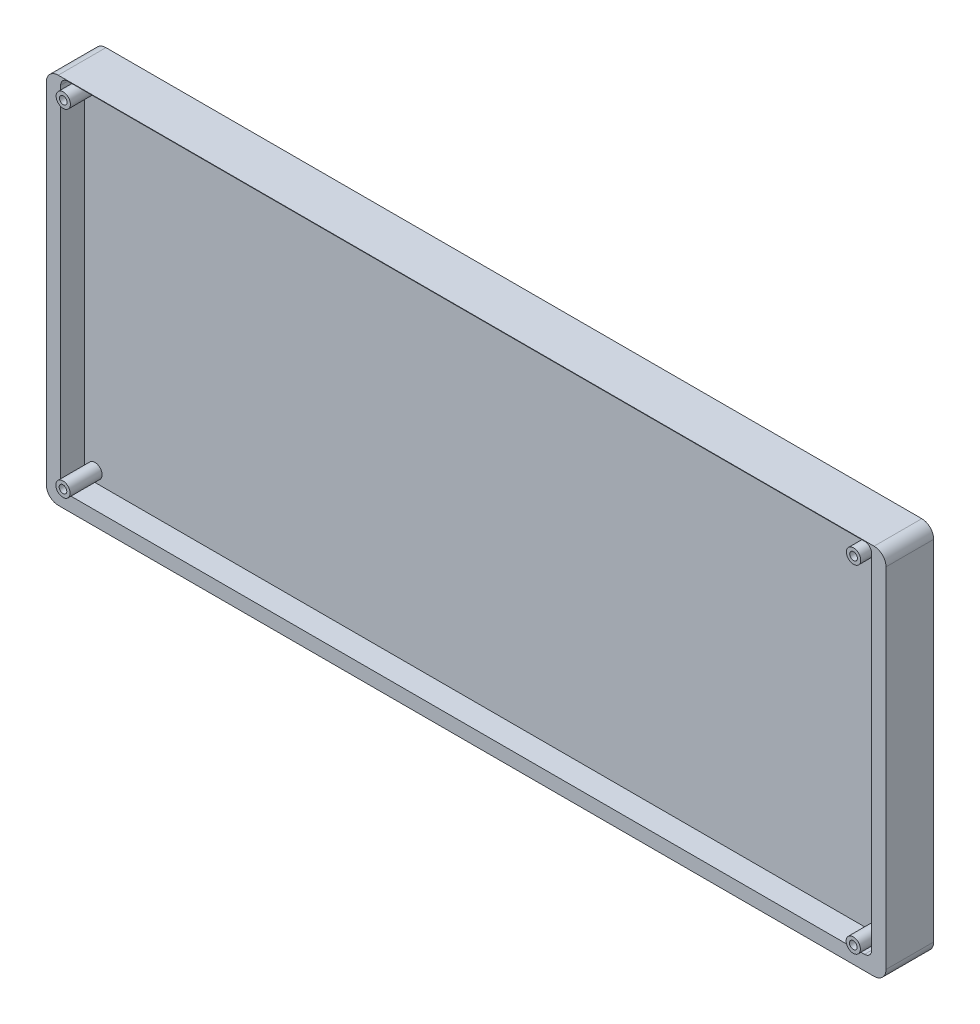
ISO-10303-21;
HEADER;
FILE_DESCRIPTION(('STEP AP214'),'2;1');
FILE_NAME('part.step','',(''),(''),'','','');
FILE_SCHEMA(('AUTOMOTIVE_DESIGN { 1 0 10303 214 1 1 1 1 }'));
ENDSEC;
DATA;
#1=APPLICATION_CONTEXT('core data for automotive mechanical design processes');
#2=APPLICATION_PROTOCOL_DEFINITION('international standard','automotive_design',2000,#1);
#3=PRODUCT_CONTEXT('',#1,'mechanical');
#4=PRODUCT('Part','Part','',(#3));
#5=PRODUCT_RELATED_PRODUCT_CATEGORY('part','',(#4));
#6=PRODUCT_DEFINITION_FORMATION('','',#4);
#7=PRODUCT_DEFINITION_CONTEXT('part definition',#1,'design');
#8=PRODUCT_DEFINITION('design','',#6,#7);
#9=PRODUCT_DEFINITION_SHAPE('','',#8);
#10=(LENGTH_UNIT() NAMED_UNIT(*) SI_UNIT(.MILLI.,.METRE.));
#11=(NAMED_UNIT(*) PLANE_ANGLE_UNIT() SI_UNIT($,.RADIAN.));
#12=(NAMED_UNIT(*) SI_UNIT($,.STERADIAN.) SOLID_ANGLE_UNIT());
#13=UNCERTAINTY_MEASURE_WITH_UNIT(LENGTH_MEASURE(1.E-05),#10,'distance_accuracy_value','');
#14=(GEOMETRIC_REPRESENTATION_CONTEXT(3) GLOBAL_UNCERTAINTY_ASSIGNED_CONTEXT((#13)) GLOBAL_UNIT_ASSIGNED_CONTEXT((#10,
#11,#12)) REPRESENTATION_CONTEXT('',''));
#15=CARTESIAN_POINT('',(0.,0.,0.));
#16=DIRECTION('',(0.,0.,1.));
#17=DIRECTION('',(1.,0.,0.));
#18=AXIS2_PLACEMENT_3D('',#15,#16,#17);
#19=CARTESIAN_POINT('',(374.280338174869,216.552249566486,10.));
#20=DIRECTION('',(0.,0.,-1.));
#21=DIRECTION('',(-1.,0.,0.));
#22=AXIS2_PLACEMENT_3D('',#19,#20,#21);
#23=CYLINDRICAL_SURFACE('',#22,1.60000381001004);
#24=CARTESIAN_POINT('',(374.280338174869,216.552249566486,10.));
#25=DIRECTION('',(0.,0.,1.));
#26=DIRECTION('',(1.,0.,0.));
#27=AXIS2_PLACEMENT_3D('',#24,#25,#26);
#28=CIRCLE('',#27,1.60000381001004);
#29=CARTESIAN_POINT('',(375.880341984879,216.552249566486,10.));
#30=VERTEX_POINT('',#29);
#31=EDGE_CURVE('E332',#30,#30,#28,.T.);
#32=ORIENTED_EDGE('',*,*,#31,.F.);
#33=EDGE_LOOP('',(#32));
#34=FACE_BOUND('',#33,.T.);
#35=CARTESIAN_POINT('',(374.280338174869,216.552249566486,23.4006327065293));
#36=DIRECTION('',(0.,0.,-1.));
#37=DIRECTION('',(-1.,0.,0.));
#38=AXIS2_PLACEMENT_3D('',#35,#36,#37);
#39=CIRCLE('',#38,1.60000381001004);
#40=CARTESIAN_POINT('',(372.680334364859,216.552249566486,23.4006327065293));
#41=VERTEX_POINT('',#40);
#42=EDGE_CURVE('E372',#41,#41,#39,.F.);
#43=ORIENTED_EDGE('',*,*,#42,.T.);
#44=EDGE_LOOP('',(#43));
#45=FACE_BOUND('',#44,.T.);
#46=ADVANCED_FACE('F41',(#34,#45),#23,.F.);
#47=CARTESIAN_POINT('',(43.0180877304192,216.425249312486,10.));
#48=DIRECTION('',(0.,0.,-1.));
#49=DIRECTION('',(-1.,0.,0.));
#50=AXIS2_PLACEMENT_3D('',#47,#48,#49);
#51=CYLINDRICAL_SURFACE('',#50,1.600003810008);
#52=CARTESIAN_POINT('',(43.0180877304192,216.425249312486,10.));
#53=DIRECTION('',(0.,0.,1.));
#54=DIRECTION('',(1.,0.,0.));
#55=AXIS2_PLACEMENT_3D('',#52,#53,#54);
#56=CIRCLE('',#55,1.600003810008);
#57=CARTESIAN_POINT('',(44.6180915404272,216.425249312486,10.));
#58=VERTEX_POINT('',#57);
#59=EDGE_CURVE('E11',#58,#58,#56,.T.);
#60=ORIENTED_EDGE('',*,*,#59,.F.);
#61=EDGE_LOOP('',(#60));
#62=FACE_BOUND('',#61,.T.);
#63=CARTESIAN_POINT('',(43.0180877304186,216.425249312487,23.4006327065293));
#64=DIRECTION('',(0.,0.,-1.));
#65=DIRECTION('',(-1.,0.,0.));
#66=AXIS2_PLACEMENT_3D('',#63,#64,#65);
#67=CIRCLE('',#66,1.600003810008);
#68=CARTESIAN_POINT('',(41.4180839204107,216.425249312487,23.4006327065293));
#69=VERTEX_POINT('',#68);
#70=EDGE_CURVE('E355',#69,#69,#67,.F.);
#71=ORIENTED_EDGE('',*,*,#70,.T.);
#72=EDGE_LOOP('',(#71));
#73=FACE_BOUND('',#72,.T.);
#74=ADVANCED_FACE('F342',(#62,#73),#51,.F.);
#75=CARTESIAN_POINT('',(42.8910874764192,75.1779671179253,10.));
#76=DIRECTION('',(0.,0.,-1.));
#77=DIRECTION('',(-1.,0.,0.));
#78=AXIS2_PLACEMENT_3D('',#75,#76,#77);
#79=CYLINDRICAL_SURFACE('',#78,1.600003810008);
#80=CARTESIAN_POINT('',(42.8910874764192,75.1779671179253,10.));
#81=DIRECTION('',(0.,0.,1.));
#82=DIRECTION('',(1.,0.,0.));
#83=AXIS2_PLACEMENT_3D('',#80,#81,#82);
#84=CIRCLE('',#83,1.600003810008);
#85=CARTESIAN_POINT('',(44.4910912864272,75.1779671179253,10.));
#86=VERTEX_POINT('',#85);
#87=EDGE_CURVE('E50',#86,#86,#84,.T.);
#88=ORIENTED_EDGE('',*,*,#87,.F.);
#89=EDGE_LOOP('',(#88));
#90=FACE_BOUND('',#89,.T.);
#91=CARTESIAN_POINT('',(42.8910874764186,75.1779671179263,23.4006327065293));
#92=DIRECTION('',(0.,0.,-1.));
#93=DIRECTION('',(-1.,0.,0.));
#94=AXIS2_PLACEMENT_3D('',#91,#92,#93);
#95=CIRCLE('',#94,1.600003810008);
#96=CARTESIAN_POINT('',(41.2910836664107,75.1779671179263,23.4006327065293));
#97=VERTEX_POINT('',#96);
#98=EDGE_CURVE('E345',#97,#97,#95,.F.);
#99=ORIENTED_EDGE('',*,*,#98,.T.);
#100=EDGE_LOOP('',(#99));
#101=FACE_BOUND('',#100,.T.);
#102=ADVANCED_FACE('F339',(#90,#101),#79,.F.);
#103=CARTESIAN_POINT('',(374.153337920869,75.3049673719253,10.));
#104=DIRECTION('',(0.,0.,-1.));
#105=DIRECTION('',(-1.,0.,0.));
#106=AXIS2_PLACEMENT_3D('',#103,#104,#105);
#107=CYLINDRICAL_SURFACE('',#106,1.60000381000802);
#108=CARTESIAN_POINT('',(374.153337920869,75.3049673719253,10.));
#109=DIRECTION('',(0.,0.,1.));
#110=DIRECTION('',(1.,0.,0.));
#111=AXIS2_PLACEMENT_3D('',#108,#109,#110);
#112=CIRCLE('',#111,1.60000381000802);
#113=CARTESIAN_POINT('',(375.753341730877,75.3049673719253,10.));
#114=VERTEX_POINT('',#113);
#115=EDGE_CURVE('E329',#114,#114,#112,.T.);
#116=ORIENTED_EDGE('',*,*,#115,.F.);
#117=EDGE_LOOP('',(#116));
#118=FACE_BOUND('',#117,.T.);
#119=CARTESIAN_POINT('',(374.153337920869,75.3049673719263,23.4006327065293));
#120=DIRECTION('',(0.,0.,-1.));
#121=DIRECTION('',(-1.,0.,0.));
#122=AXIS2_PLACEMENT_3D('',#119,#120,#121);
#123=CIRCLE('',#122,1.60000381000801);
#124=CARTESIAN_POINT('',(372.553334110861,75.3049673719263,23.4006327065293));
#125=VERTEX_POINT('',#124);
#126=EDGE_CURVE('E358',#125,#125,#123,.F.);
#127=ORIENTED_EDGE('',*,*,#126,.T.);
#128=EDGE_LOOP('',(#127));
#129=FACE_BOUND('',#128,.T.);
#130=ADVANCED_FACE('F43',(#118,#129),#107,.F.);
#131=CARTESIAN_POINT('',(0.,0.,10.));
#132=DIRECTION('',(0.,0.,1.));
#133=DIRECTION('',(1.,0.,0.));
#134=AXIS2_PLACEMENT_3D('',#131,#132,#133);
#135=PLANE('',#134);
#136=CARTESIAN_POINT('',(43.0180877304186,216.425249312487,10.));
#137=DIRECTION('',(0.,0.,1.));
#138=DIRECTION('',(1.,0.,0.));
#139=AXIS2_PLACEMENT_3D('',#136,#137,#138);
#140=CIRCLE('',#139,3.);
#141=CARTESIAN_POINT('',(46.0180877304187,216.425249312487,10.));
#142=VERTEX_POINT('',#141);
#143=EDGE_CURVE('E367',#142,#142,#140,.T.);
#144=ORIENTED_EDGE('',*,*,#143,.F.);
#145=EDGE_LOOP('',(#144));
#146=FACE_BOUND('',#145,.T.);
#147=CARTESIAN_POINT('',(41.4930915404192,217.880938923865,10.));
#148=DIRECTION('',(0.,0.,1.));
#149=DIRECTION('',(1.,0.,0.));
#150=AXIS2_PLACEMENT_3D('',#147,#148,#149);
#151=CIRCLE('',#150,2.98730505461);
#152=CARTESIAN_POINT('',(41.4930915404192,220.868243978475,10.));
#153=VERTEX_POINT('',#152);
#154=CARTESIAN_POINT('',(38.5057864858092,217.880938923865,10.));
#155=VERTEX_POINT('',#154);
#156=EDGE_CURVE('E65',#153,#155,#151,.T.);
#157=ORIENTED_EDGE('',*,*,#156,.T.);
#158=DIRECTION('',(0.,1.,0.));
#159=VECTOR('',#158,1.);
#160=CARTESIAN_POINT('',(38.5057864858092,0.,10.));
#161=LINE('',#160,#159);
#162=CARTESIAN_POINT('',(38.5057864858092,73.8806493632953,10.));
#163=VERTEX_POINT('',#162);
#164=EDGE_CURVE('E240',#163,#155,#161,.T.);
#165=ORIENTED_EDGE('',*,*,#164,.F.);
#166=CARTESIAN_POINT('',(41.4930915404192,73.8806493632953,10.));
#167=DIRECTION('',(0.,0.,1.));
#168=DIRECTION('',(1.,0.,0.));
#169=AXIS2_PLACEMENT_3D('',#166,#167,#168);
#170=CIRCLE('',#169,2.98730505461);
#171=CARTESIAN_POINT('',(41.4930915404192,70.8933443086853,10.));
#172=VERTEX_POINT('',#171);
#173=EDGE_CURVE('E307',#163,#172,#170,.T.);
#174=ORIENTED_EDGE('',*,*,#173,.T.);
#175=DIRECTION('',(-1.,0.,0.));
#176=VECTOR('',#175,1.);
#177=CARTESIAN_POINT('',(0.,70.8933443086853,10.));
#178=LINE('',#177,#176);
#179=CARTESIAN_POINT('',(375.493762101719,70.8933443086853,10.));
#180=VERTEX_POINT('',#179);
#181=EDGE_CURVE('E311',#180,#172,#178,.T.);
#182=ORIENTED_EDGE('',*,*,#181,.F.);
#183=CARTESIAN_POINT('',(375.493762101719,73.8806493632953,10.));
#184=DIRECTION('',(0.,0.,1.));
#185=DIRECTION('',(1.,0.,0.));
#186=AXIS2_PLACEMENT_3D('',#183,#184,#185);
#187=CIRCLE('',#186,2.98730505461002);
#188=CARTESIAN_POINT('',(378.481067156329,73.8806493632953,10.));
#189=VERTEX_POINT('',#188);
#190=EDGE_CURVE('E314',#180,#189,#187,.T.);
#191=ORIENTED_EDGE('',*,*,#190,.T.);
#192=DIRECTION('',(0.,-1.,0.));
#193=VECTOR('',#192,1.);
#194=CARTESIAN_POINT('',(378.481067156329,1.38777878078145E-13,10.));
#195=LINE('',#194,#193);
#196=CARTESIAN_POINT('',(378.481067156329,217.880938923865,10.));
#197=VERTEX_POINT('',#196);
#198=EDGE_CURVE('E318',#197,#189,#195,.T.);
#199=ORIENTED_EDGE('',*,*,#198,.F.);
#200=CARTESIAN_POINT('',(375.493762101719,217.880938923865,10.));
#201=DIRECTION('',(0.,0.,1.));
#202=DIRECTION('',(1.,0.,0.));
#203=AXIS2_PLACEMENT_3D('',#200,#201,#202);
#204=CIRCLE('',#203,2.98730505460998);
#205=CARTESIAN_POINT('',(375.493762101719,220.868243978475,10.));
#206=VERTEX_POINT('',#205);
#207=EDGE_CURVE('E321',#197,#206,#204,.T.);
#208=ORIENTED_EDGE('',*,*,#207,.T.);
#209=DIRECTION('',(1.,0.,0.));
#210=VECTOR('',#209,1.);
#211=CARTESIAN_POINT('',(0.,220.868243978475,10.));
#212=LINE('',#211,#210);
#213=EDGE_CURVE('E160',#153,#206,#212,.T.);
#214=ORIENTED_EDGE('',*,*,#213,.F.);
#215=EDGE_LOOP('',(#157,#165,#174,#182,#191,#199,#208,#214));
#216=FACE_BOUND('',#215,.T.);
#217=CARTESIAN_POINT('',(374.280338174869,216.552249566486,10.));
#218=DIRECTION('',(0.,0.,1.));
#219=DIRECTION('',(1.,0.,0.));
#220=AXIS2_PLACEMENT_3D('',#217,#218,#219);
#221=CIRCLE('',#220,2.99999999999999);
#222=CARTESIAN_POINT('',(377.280338174869,216.552249566486,10.));
#223=VERTEX_POINT('',#222);
#224=EDGE_CURVE('E328',#223,#223,#221,.T.);
#225=ORIENTED_EDGE('',*,*,#224,.F.);
#226=EDGE_LOOP('',(#225));
#227=FACE_BOUND('',#226,.T.);
#228=CARTESIAN_POINT('',(374.153337920869,75.3049673719263,10.));
#229=DIRECTION('',(0.,0.,1.));
#230=DIRECTION('',(1.,0.,0.));
#231=AXIS2_PLACEMENT_3D('',#228,#229,#230);
#232=CIRCLE('',#231,2.99999999999999);
#233=CARTESIAN_POINT('',(377.153337920869,75.3049673719263,10.));
#234=VERTEX_POINT('',#233);
#235=EDGE_CURVE('E366',#234,#234,#232,.T.);
#236=ORIENTED_EDGE('',*,*,#235,.F.);
#237=EDGE_LOOP('',(#236));
#238=FACE_BOUND('',#237,.T.);
#239=CARTESIAN_POINT('',(42.8910874764186,75.1779671179263,10.));
#240=DIRECTION('',(0.,0.,1.));
#241=DIRECTION('',(1.,0.,0.));
#242=AXIS2_PLACEMENT_3D('',#239,#240,#241);
#243=CIRCLE('',#242,3.);
#244=CARTESIAN_POINT('',(45.8910874764187,75.1779671179263,10.));
#245=VERTEX_POINT('',#244);
#246=EDGE_CURVE('E362',#245,#245,#243,.T.);
#247=ORIENTED_EDGE('',*,*,#246,.F.);
#248=EDGE_LOOP('',(#247));
#249=FACE_BOUND('',#248,.T.);
#250=ADVANCED_FACE('F391',(#146,#216,#227,#238,#249),#135,.T.);
#251=CARTESIAN_POINT('',(0.,0.,0.));
#252=DIRECTION('',(0.,0.,1.));
#253=DIRECTION('',(1.,0.,0.));
#254=AXIS2_PLACEMENT_3D('',#251,#252,#253);
#255=PLANE('',#254);
#256=CARTESIAN_POINT('',(379.481067156329,216.052935406006,0.));
#257=DIRECTION('',(0.,0.,1.));
#258=DIRECTION('',(1.,0.,0.));
#259=AXIS2_PLACEMENT_3D('',#256,#257,#258);
#260=CIRCLE('',#259,5.);
#261=CARTESIAN_POINT('',(379.481067156329,221.052935406006,0.));
#262=VERTEX_POINT('',#261);
#263=CARTESIAN_POINT('',(384.481067156329,216.052935406006,0.));
#264=VERTEX_POINT('',#263);
#265=EDGE_CURVE('E241',#262,#264,#260,.F.);
#266=ORIENTED_EDGE('',*,*,#265,.T.);
#267=DIRECTION('',(0.,-1.,0.));
#268=VECTOR('',#267,1.);
#269=CARTESIAN_POINT('',(384.481067156329,216.052935406006,0.));
#270=LINE('',#269,#268);
#271=CARTESIAN_POINT('',(384.481067156329,69.8933443086862,0.));
#272=VERTEX_POINT('',#271);
#273=EDGE_CURVE('E258',#264,#272,#270,.T.);
#274=ORIENTED_EDGE('',*,*,#273,.T.);
#275=CARTESIAN_POINT('',(379.481067156329,69.8933443086862,0.));
#276=DIRECTION('',(0.,0.,1.));
#277=DIRECTION('',(1.,0.,0.));
#278=AXIS2_PLACEMENT_3D('',#275,#276,#277);
#279=CIRCLE('',#278,5.);
#280=CARTESIAN_POINT('',(379.481067156329,64.8933443086862,0.));
#281=VERTEX_POINT('',#280);
#282=EDGE_CURVE('E255',#272,#281,#279,.F.);
#283=ORIENTED_EDGE('',*,*,#282,.T.);
#284=DIRECTION('',(-1.,0.,0.));
#285=VECTOR('',#284,1.);
#286=CARTESIAN_POINT('',(379.481067156329,64.8933443086862,0.));
#287=LINE('',#286,#285);
#288=CARTESIAN_POINT('',(37.5010671563295,64.8933443086862,0.));
#289=VERTEX_POINT('',#288);
#290=EDGE_CURVE('E252',#281,#289,#287,.T.);
#291=ORIENTED_EDGE('',*,*,#290,.T.);
#292=CARTESIAN_POINT('',(37.5010671563295,69.8933443086862,0.));
#293=DIRECTION('',(0.,0.,1.));
#294=DIRECTION('',(1.,0.,0.));
#295=AXIS2_PLACEMENT_3D('',#292,#293,#294);
#296=CIRCLE('',#295,5.);
#297=CARTESIAN_POINT('',(32.5010671563295,69.8933443086862,0.));
#298=VERTEX_POINT('',#297);
#299=EDGE_CURVE('E249',#289,#298,#296,.F.);
#300=ORIENTED_EDGE('',*,*,#299,.T.);
#301=DIRECTION('',(0.,1.,0.));
#302=VECTOR('',#301,1.);
#303=CARTESIAN_POINT('',(32.5010671563295,69.8933443086862,0.));
#304=LINE('',#303,#302);
#305=CARTESIAN_POINT('',(32.5010671563295,216.052935406006,0.));
#306=VERTEX_POINT('',#305);
#307=EDGE_CURVE('E245',#298,#306,#304,.T.);
#308=ORIENTED_EDGE('',*,*,#307,.T.);
#309=CARTESIAN_POINT('',(37.5010671563295,216.052935406006,0.));
#310=DIRECTION('',(0.,0.,1.));
#311=DIRECTION('',(1.,0.,0.));
#312=AXIS2_PLACEMENT_3D('',#309,#310,#311);
#313=CIRCLE('',#312,5.);
#314=CARTESIAN_POINT('',(37.5010671563295,221.052935406006,0.));
#315=VERTEX_POINT('',#314);
#316=EDGE_CURVE('E242',#306,#315,#313,.F.);
#317=ORIENTED_EDGE('',*,*,#316,.T.);
#318=DIRECTION('',(1.,0.,0.));
#319=VECTOR('',#318,1.);
#320=CARTESIAN_POINT('',(379.481067156329,221.052935406006,0.));
#321=LINE('',#320,#319);
#322=EDGE_CURVE('E237',#315,#262,#321,.T.);
#323=ORIENTED_EDGE('',*,*,#322,.T.);
#324=EDGE_LOOP('',(#266,#274,#283,#291,#300,#308,#317,#323));
#325=FACE_BOUND('',#324,.T.);
#326=ADVANCED_FACE('F394',(#325),#255,.F.);
#327=CARTESIAN_POINT('',(379.481067156329,221.052935406006,-385.065888247299));
#328=DIRECTION('',(0.,1.,0.));
#329=DIRECTION('',(0.,0.,1.));
#330=AXIS2_PLACEMENT_3D('',#327,#328,#329);
#331=PLANE('',#330);
#332=ORIENTED_EDGE('',*,*,#322,.F.);
#333=DIRECTION('',(0.,0.,1.));
#334=VECTOR('',#333,1.);
#335=CARTESIAN_POINT('',(37.5010671563295,221.052935406006,-385.065888247299));
#336=LINE('',#335,#334);
#337=CARTESIAN_POINT('',(37.5010671563295,221.052935406006,20.));
#338=VERTEX_POINT('',#337);
#339=EDGE_CURVE('E300',#315,#338,#336,.T.);
#340=ORIENTED_EDGE('',*,*,#339,.T.);
#341=DIRECTION('',(-1.,0.,0.));
#342=VECTOR('',#341,1.);
#343=CARTESIAN_POINT('',(379.481067156329,221.052935406006,20.));
#344=LINE('',#343,#342);
#345=CARTESIAN_POINT('',(379.481067156329,221.052935406006,20.));
#346=VERTEX_POINT('',#345);
#347=EDGE_CURVE('E210',#346,#338,#344,.T.);
#348=ORIENTED_EDGE('',*,*,#347,.F.);
#349=DIRECTION('',(0.,0.,1.));
#350=VECTOR('',#349,1.);
#351=CARTESIAN_POINT('',(379.481067156329,221.052935406006,-385.065888247299));
#352=LINE('',#351,#350);
#353=EDGE_CURVE('E265',#262,#346,#352,.T.);
#354=ORIENTED_EDGE('',*,*,#353,.F.);
#355=EDGE_LOOP('',(#332,#340,#348,#354));
#356=FACE_BOUND('',#355,.T.);
#357=ADVANCED_FACE('F431',(#356),#331,.T.);
#358=CARTESIAN_POINT('',(37.5010671563295,216.052935406006,-385.065888247299));
#359=DIRECTION('',(0.,0.,1.));
#360=DIRECTION('',(1.,0.,0.));
#361=AXIS2_PLACEMENT_3D('',#358,#359,#360);
#362=CYLINDRICAL_SURFACE('',#361,5.);
#363=ORIENTED_EDGE('',*,*,#316,.F.);
#364=DIRECTION('',(0.,0.,1.));
#365=VECTOR('',#364,1.);
#366=CARTESIAN_POINT('',(32.5010671563295,216.052935406006,-385.065888247299));
#367=LINE('',#366,#365);
#368=CARTESIAN_POINT('',(32.5010671563295,216.052935406006,20.));
#369=VERTEX_POINT('',#368);
#370=EDGE_CURVE('E297',#306,#369,#367,.T.);
#371=ORIENTED_EDGE('',*,*,#370,.T.);
#372=CARTESIAN_POINT('',(37.5010671563295,216.052935406006,20.));
#373=DIRECTION('',(0.,0.,1.));
#374=DIRECTION('',(1.,0.,0.));
#375=AXIS2_PLACEMENT_3D('',#372,#373,#374);
#376=CIRCLE('',#375,5.);
#377=EDGE_CURVE('E214',#338,#369,#376,.T.);
#378=ORIENTED_EDGE('',*,*,#377,.F.);
#379=ORIENTED_EDGE('',*,*,#339,.F.);
#380=EDGE_LOOP('',(#363,#371,#378,#379));
#381=FACE_BOUND('',#380,.T.);
#382=ADVANCED_FACE('F441',(#381),#362,.T.);
#383=CARTESIAN_POINT('',(32.5010671563295,69.8933443086862,-385.065888247299));
#384=DIRECTION('',(-1.,0.,0.));
#385=DIRECTION('',(0.,0.,1.));
#386=AXIS2_PLACEMENT_3D('',#383,#384,#385);
#387=PLANE('',#386);
#388=ORIENTED_EDGE('',*,*,#307,.F.);
#389=DIRECTION('',(0.,0.,1.));
#390=VECTOR('',#389,1.);
#391=CARTESIAN_POINT('',(32.5010671563295,69.8933443086862,-385.065888247299));
#392=LINE('',#391,#390);
#393=CARTESIAN_POINT('',(32.5010671563295,69.8933443086862,20.));
#394=VERTEX_POINT('',#393);
#395=EDGE_CURVE('E294',#298,#394,#392,.T.);
#396=ORIENTED_EDGE('',*,*,#395,.T.);
#397=DIRECTION('',(0.,-1.,0.));
#398=VECTOR('',#397,1.);
#399=CARTESIAN_POINT('',(32.5010671563295,69.8933443086862,20.));
#400=LINE('',#399,#398);
#401=EDGE_CURVE('E218',#369,#394,#400,.T.);
#402=ORIENTED_EDGE('',*,*,#401,.F.);
#403=ORIENTED_EDGE('',*,*,#370,.F.);
#404=EDGE_LOOP('',(#388,#396,#402,#403));
#405=FACE_BOUND('',#404,.T.);
#406=ADVANCED_FACE('F445',(#405),#387,.T.);
#407=CARTESIAN_POINT('',(37.5010671563295,69.8933443086862,-385.065888247299));
#408=DIRECTION('',(0.,0.,1.));
#409=DIRECTION('',(1.,0.,0.));
#410=AXIS2_PLACEMENT_3D('',#407,#408,#409);
#411=CYLINDRICAL_SURFACE('',#410,5.);
#412=ORIENTED_EDGE('',*,*,#299,.F.);
#413=DIRECTION('',(0.,0.,1.));
#414=VECTOR('',#413,1.);
#415=CARTESIAN_POINT('',(37.5010671563295,64.8933443086862,-385.065888247299));
#416=LINE('',#415,#414);
#417=CARTESIAN_POINT('',(37.5010671563295,64.8933443086862,20.));
#418=VERTEX_POINT('',#417);
#419=EDGE_CURVE('E291',#289,#418,#416,.T.);
#420=ORIENTED_EDGE('',*,*,#419,.T.);
#421=CARTESIAN_POINT('',(37.5010671563295,69.8933443086862,20.));
#422=DIRECTION('',(0.,0.,1.));
#423=DIRECTION('',(-1.,0.,0.));
#424=AXIS2_PLACEMENT_3D('',#421,#422,#423);
#425=CIRCLE('',#424,5.);
#426=EDGE_CURVE('E222',#394,#418,#425,.T.);
#427=ORIENTED_EDGE('',*,*,#426,.F.);
#428=ORIENTED_EDGE('',*,*,#395,.F.);
#429=EDGE_LOOP('',(#412,#420,#427,#428));
#430=FACE_BOUND('',#429,.T.);
#431=ADVANCED_FACE('F449',(#430),#411,.T.);
#432=CARTESIAN_POINT('',(379.481067156329,64.8933443086862,-385.065888247299));
#433=DIRECTION('',(0.,-1.,0.));
#434=DIRECTION('',(0.,0.,-1.));
#435=AXIS2_PLACEMENT_3D('',#432,#433,#434);
#436=PLANE('',#435);
#437=ORIENTED_EDGE('',*,*,#290,.F.);
#438=DIRECTION('',(0.,0.,1.));
#439=VECTOR('',#438,1.);
#440=CARTESIAN_POINT('',(379.481067156329,64.8933443086862,-385.065888247299));
#441=LINE('',#440,#439);
#442=CARTESIAN_POINT('',(379.481067156329,64.8933443086862,20.));
#443=VERTEX_POINT('',#442);
#444=EDGE_CURVE('E288',#281,#443,#441,.T.);
#445=ORIENTED_EDGE('',*,*,#444,.T.);
#446=DIRECTION('',(1.,0.,0.));
#447=VECTOR('',#446,1.);
#448=CARTESIAN_POINT('',(379.481067156329,64.8933443086862,20.));
#449=LINE('',#448,#447);
#450=EDGE_CURVE('E226',#418,#443,#449,.T.);
#451=ORIENTED_EDGE('',*,*,#450,.F.);
#452=ORIENTED_EDGE('',*,*,#419,.F.);
#453=EDGE_LOOP('',(#437,#445,#451,#452));
#454=FACE_BOUND('',#453,.T.);
#455=ADVANCED_FACE('F453',(#454),#436,.T.);
#456=CARTESIAN_POINT('',(379.481067156329,69.8933443086862,-385.065888247299));
#457=DIRECTION('',(0.,0.,1.));
#458=DIRECTION('',(1.,0.,0.));
#459=AXIS2_PLACEMENT_3D('',#456,#457,#458);
#460=CYLINDRICAL_SURFACE('',#459,5.);
#461=ORIENTED_EDGE('',*,*,#282,.F.);
#462=DIRECTION('',(0.,0.,1.));
#463=VECTOR('',#462,1.);
#464=CARTESIAN_POINT('',(384.481067156329,69.8933443086862,-385.065888247299));
#465=LINE('',#464,#463);
#466=CARTESIAN_POINT('',(384.481067156329,69.8933443086862,20.));
#467=VERTEX_POINT('',#466);
#468=EDGE_CURVE('E285',#272,#467,#465,.T.);
#469=ORIENTED_EDGE('',*,*,#468,.T.);
#470=CARTESIAN_POINT('',(379.481067156329,69.8933443086862,20.));
#471=DIRECTION('',(0.,0.,1.));
#472=DIRECTION('',(-1.,0.,0.));
#473=AXIS2_PLACEMENT_3D('',#470,#471,#472);
#474=CIRCLE('',#473,5.);
#475=EDGE_CURVE('E230',#443,#467,#474,.T.);
#476=ORIENTED_EDGE('',*,*,#475,.F.);
#477=ORIENTED_EDGE('',*,*,#444,.F.);
#478=EDGE_LOOP('',(#461,#469,#476,#477));
#479=FACE_BOUND('',#478,.T.);
#480=ADVANCED_FACE('F457',(#479),#460,.T.);
#481=CARTESIAN_POINT('',(384.481067156329,216.052935406006,-385.065888247299));
#482=DIRECTION('',(1.,0.,0.));
#483=DIRECTION('',(0.,1.,0.));
#484=AXIS2_PLACEMENT_3D('',#481,#482,#483);
#485=PLANE('',#484);
#486=ORIENTED_EDGE('',*,*,#273,.F.);
#487=DIRECTION('',(0.,0.,1.));
#488=VECTOR('',#487,1.);
#489=CARTESIAN_POINT('',(384.481067156329,216.052935406006,-385.065888247299));
#490=LINE('',#489,#488);
#491=CARTESIAN_POINT('',(384.481067156329,216.052935406006,20.));
#492=VERTEX_POINT('',#491);
#493=EDGE_CURVE('E246',#264,#492,#490,.T.);
#494=ORIENTED_EDGE('',*,*,#493,.T.);
#495=DIRECTION('',(0.,1.,0.));
#496=VECTOR('',#495,1.);
#497=CARTESIAN_POINT('',(384.481067156329,216.052935406006,20.));
#498=LINE('',#497,#496);
#499=EDGE_CURVE('E164',#467,#492,#498,.T.);
#500=ORIENTED_EDGE('',*,*,#499,.F.);
#501=ORIENTED_EDGE('',*,*,#468,.F.);
#502=EDGE_LOOP('',(#486,#494,#500,#501));
#503=FACE_BOUND('',#502,.T.);
#504=ADVANCED_FACE('F437',(#503),#485,.T.);
#505=CARTESIAN_POINT('',(379.481067156329,216.052935406006,-385.065888247299));
#506=DIRECTION('',(0.,0.,1.));
#507=DIRECTION('',(1.,0.,0.));
#508=AXIS2_PLACEMENT_3D('',#505,#506,#507);
#509=CYLINDRICAL_SURFACE('',#508,5.);
#510=ORIENTED_EDGE('',*,*,#265,.F.);
#511=ORIENTED_EDGE('',*,*,#353,.T.);
#512=CARTESIAN_POINT('',(379.481067156329,216.052935406006,20.));
#513=DIRECTION('',(0.,0.,1.));
#514=DIRECTION('',(1.,0.,0.));
#515=AXIS2_PLACEMENT_3D('',#512,#513,#514);
#516=CIRCLE('',#515,5.);
#517=EDGE_CURVE('E206',#492,#346,#516,.T.);
#518=ORIENTED_EDGE('',*,*,#517,.F.);
#519=ORIENTED_EDGE('',*,*,#493,.F.);
#520=EDGE_LOOP('',(#510,#511,#518,#519));
#521=FACE_BOUND('',#520,.T.);
#522=ADVANCED_FACE('F434',(#521),#509,.T.);
#523=CARTESIAN_POINT('',(41.4930915404192,220.868243978475,-385.065888247299));
#524=DIRECTION('',(0.,1.,0.));
#525=DIRECTION('',(-1.,0.,0.));
#526=AXIS2_PLACEMENT_3D('',#523,#524,#525);
#527=PLANE('',#526);
#528=ORIENTED_EDGE('',*,*,#213,.T.);
#529=DIRECTION('',(0.,0.,1.));
#530=VECTOR('',#529,1.);
#531=CARTESIAN_POINT('',(375.493762101719,220.868243978475,-385.065888247299));
#532=LINE('',#531,#530);
#533=CARTESIAN_POINT('',(375.493762101719,220.868243978475,20.));
#534=VERTEX_POINT('',#533);
#535=EDGE_CURVE('E57',#206,#534,#532,.T.);
#536=ORIENTED_EDGE('',*,*,#535,.T.);
#537=DIRECTION('',(-1.,0.,0.));
#538=VECTOR('',#537,1.);
#539=CARTESIAN_POINT('',(41.4930915404192,220.868243978475,20.));
#540=LINE('',#539,#538);
#541=CARTESIAN_POINT('',(41.4930915404192,220.868243978475,20.));
#542=VERTEX_POINT('',#541);
#543=EDGE_CURVE('E157',#534,#542,#540,.T.);
#544=ORIENTED_EDGE('',*,*,#543,.T.);
#545=DIRECTION('',(0.,0.,1.));
#546=VECTOR('',#545,1.);
#547=CARTESIAN_POINT('',(41.4930915404192,220.868243978475,-385.065888247299));
#548=LINE('',#547,#546);
#549=EDGE_CURVE('E163',#153,#542,#548,.T.);
#550=ORIENTED_EDGE('',*,*,#549,.F.);
#551=EDGE_LOOP('',(#528,#536,#544,#550));
#552=FACE_BOUND('',#551,.T.);
#553=ADVANCED_FACE('F155',(#552),#527,.F.);
#554=CARTESIAN_POINT('',(41.4930915404192,217.880938923865,-385.065888247299));
#555=DIRECTION('',(0.,0.,1.));
#556=DIRECTION('',(1.,0.,0.));
#557=AXIS2_PLACEMENT_3D('',#554,#555,#556);
#558=CYLINDRICAL_SURFACE('',#557,2.98730505461001);
#559=ORIENTED_EDGE('',*,*,#156,.F.);
#560=ORIENTED_EDGE('',*,*,#549,.T.);
#561=CARTESIAN_POINT('',(41.4930915404192,217.880938923865,20.));
#562=DIRECTION('',(0.,0.,1.));
#563=DIRECTION('',(1.,0.,0.));
#564=AXIS2_PLACEMENT_3D('',#561,#562,#563);
#565=CIRCLE('',#564,2.98730505461001);
#566=CARTESIAN_POINT('',(38.5057864858092,217.880938923865,20.));
#567=VERTEX_POINT('',#566);
#568=EDGE_CURVE('E180',#542,#567,#565,.T.);
#569=ORIENTED_EDGE('',*,*,#568,.T.);
#570=DIRECTION('',(0.,0.,1.));
#571=VECTOR('',#570,1.);
#572=CARTESIAN_POINT('',(38.5057864858092,217.880938923865,-385.065888247299));
#573=LINE('',#572,#571);
#574=EDGE_CURVE('E278',#155,#567,#573,.T.);
#575=ORIENTED_EDGE('',*,*,#574,.F.);
#576=EDGE_LOOP('',(#559,#560,#569,#575));
#577=FACE_BOUND('',#576,.T.);
#578=ADVANCED_FACE('F470',(#577),#558,.F.);
#579=CARTESIAN_POINT('',(38.5057864858092,73.8806493632953,-385.065888247299));
#580=DIRECTION('',(-1.,0.,0.));
#581=DIRECTION('',(0.,0.,1.));
#582=AXIS2_PLACEMENT_3D('',#579,#580,#581);
#583=PLANE('',#582);
#584=ORIENTED_EDGE('',*,*,#164,.T.);
#585=ORIENTED_EDGE('',*,*,#574,.T.);
#586=DIRECTION('',(0.,-1.,0.));
#587=VECTOR('',#586,1.);
#588=CARTESIAN_POINT('',(38.5057864858092,73.8806493632953,20.));
#589=LINE('',#588,#587);
#590=CARTESIAN_POINT('',(38.5057864858092,73.8806493632953,20.));
#591=VERTEX_POINT('',#590);
#592=EDGE_CURVE('E184',#567,#591,#589,.T.);
#593=ORIENTED_EDGE('',*,*,#592,.T.);
#594=DIRECTION('',(0.,0.,1.));
#595=VECTOR('',#594,1.);
#596=CARTESIAN_POINT('',(38.5057864858092,73.8806493632953,-385.065888247299));
#597=LINE('',#596,#595);
#598=EDGE_CURVE('E275',#163,#591,#597,.T.);
#599=ORIENTED_EDGE('',*,*,#598,.F.);
#600=EDGE_LOOP('',(#584,#585,#593,#599));
#601=FACE_BOUND('',#600,.T.);
#602=ADVANCED_FACE('F473',(#601),#583,.F.);
#603=CARTESIAN_POINT('',(41.4930915404192,73.8806493632953,-385.065888247299));
#604=DIRECTION('',(0.,0.,1.));
#605=DIRECTION('',(1.,0.,0.));
#606=AXIS2_PLACEMENT_3D('',#603,#604,#605);
#607=CYLINDRICAL_SURFACE('',#606,2.98730505461001);
#608=ORIENTED_EDGE('',*,*,#173,.F.);
#609=ORIENTED_EDGE('',*,*,#598,.T.);
#610=CARTESIAN_POINT('',(41.4930915404192,73.8806493632953,20.));
#611=DIRECTION('',(0.,0.,1.));
#612=DIRECTION('',(1.,0.,0.));
#613=AXIS2_PLACEMENT_3D('',#610,#611,#612);
#614=CIRCLE('',#613,2.98730505461001);
#615=CARTESIAN_POINT('',(41.4930915404192,70.8933443086853,20.));
#616=VERTEX_POINT('',#615);
#617=EDGE_CURVE('E191',#591,#616,#614,.T.);
#618=ORIENTED_EDGE('',*,*,#617,.T.);
#619=DIRECTION('',(0.,0.,1.));
#620=VECTOR('',#619,1.);
#621=CARTESIAN_POINT('',(41.4930915404192,70.8933443086853,-385.065888247299));
#622=LINE('',#621,#620);
#623=EDGE_CURVE('E272',#172,#616,#622,.T.);
#624=ORIENTED_EDGE('',*,*,#623,.F.);
#625=EDGE_LOOP('',(#608,#609,#618,#624));
#626=FACE_BOUND('',#625,.T.);
#627=ADVANCED_FACE('F476',(#626),#607,.F.);
#628=CARTESIAN_POINT('',(375.493762101719,70.8933443086853,-385.065888247299));
#629=DIRECTION('',(0.,-1.,0.));
#630=DIRECTION('',(1.,0.,0.));
#631=AXIS2_PLACEMENT_3D('',#628,#629,#630);
#632=PLANE('',#631);
#633=ORIENTED_EDGE('',*,*,#181,.T.);
#634=ORIENTED_EDGE('',*,*,#623,.T.);
#635=DIRECTION('',(1.,0.,0.));
#636=VECTOR('',#635,1.);
#637=CARTESIAN_POINT('',(375.493762101719,70.8933443086853,20.));
#638=LINE('',#637,#636);
#639=CARTESIAN_POINT('',(375.493762101719,70.8933443086853,20.));
#640=VERTEX_POINT('',#639);
#641=EDGE_CURVE('E195',#616,#640,#638,.T.);
#642=ORIENTED_EDGE('',*,*,#641,.T.);
#643=DIRECTION('',(0.,0.,1.));
#644=VECTOR('',#643,1.);
#645=CARTESIAN_POINT('',(375.493762101719,70.8933443086853,-385.065888247299));
#646=LINE('',#645,#644);
#647=EDGE_CURVE('E269',#180,#640,#646,.T.);
#648=ORIENTED_EDGE('',*,*,#647,.F.);
#649=EDGE_LOOP('',(#633,#634,#642,#648));
#650=FACE_BOUND('',#649,.T.);
#651=ADVANCED_FACE('F480',(#650),#632,.F.);
#652=CARTESIAN_POINT('',(375.493762101719,73.8806493632953,-385.065888247299));
#653=DIRECTION('',(0.,0.,1.));
#654=DIRECTION('',(1.,0.,0.));
#655=AXIS2_PLACEMENT_3D('',#652,#653,#654);
#656=CYLINDRICAL_SURFACE('',#655,2.98730505461003);
#657=ORIENTED_EDGE('',*,*,#190,.F.);
#658=ORIENTED_EDGE('',*,*,#647,.T.);
#659=CARTESIAN_POINT('',(375.493762101719,73.8806493632953,20.));
#660=DIRECTION('',(0.,0.,1.));
#661=DIRECTION('',(1.,0.,0.));
#662=AXIS2_PLACEMENT_3D('',#659,#660,#661);
#663=CIRCLE('',#662,2.98730505461003);
#664=CARTESIAN_POINT('',(378.481067156329,73.8806493632953,20.));
#665=VERTEX_POINT('',#664);
#666=EDGE_CURVE('E199',#640,#665,#663,.T.);
#667=ORIENTED_EDGE('',*,*,#666,.T.);
#668=DIRECTION('',(0.,0.,1.));
#669=VECTOR('',#668,1.);
#670=CARTESIAN_POINT('',(378.481067156329,73.8806493632953,-385.065888247299));
#671=LINE('',#670,#669);
#672=EDGE_CURVE('E266',#189,#665,#671,.T.);
#673=ORIENTED_EDGE('',*,*,#672,.F.);
#674=EDGE_LOOP('',(#657,#658,#667,#673));
#675=FACE_BOUND('',#674,.T.);
#676=ADVANCED_FACE('F484',(#675),#656,.F.);
#677=CARTESIAN_POINT('',(378.481067156329,217.880938923865,-385.065888247299));
#678=DIRECTION('',(1.,0.,0.));
#679=DIRECTION('',(0.,1.,0.));
#680=AXIS2_PLACEMENT_3D('',#677,#678,#679);
#681=PLANE('',#680);
#682=ORIENTED_EDGE('',*,*,#198,.T.);
#683=ORIENTED_EDGE('',*,*,#672,.T.);
#684=DIRECTION('',(0.,1.,0.));
#685=VECTOR('',#684,1.);
#686=CARTESIAN_POINT('',(378.481067156329,217.880938923865,20.));
#687=LINE('',#686,#685);
#688=CARTESIAN_POINT('',(378.481067156329,217.880938923865,20.));
#689=VERTEX_POINT('',#688);
#690=EDGE_CURVE('E203',#665,#689,#687,.T.);
#691=ORIENTED_EDGE('',*,*,#690,.T.);
#692=DIRECTION('',(0.,0.,1.));
#693=VECTOR('',#692,1.);
#694=CARTESIAN_POINT('',(378.481067156329,217.880938923865,-385.065888247299));
#695=LINE('',#694,#693);
#696=EDGE_CURVE('E170',#197,#689,#695,.T.);
#697=ORIENTED_EDGE('',*,*,#696,.F.);
#698=EDGE_LOOP('',(#682,#683,#691,#697));
#699=FACE_BOUND('',#698,.T.);
#700=ADVANCED_FACE('F467',(#699),#681,.F.);
#701=CARTESIAN_POINT('',(375.493762101719,217.880938923865,-385.065888247299));
#702=DIRECTION('',(0.,0.,1.));
#703=DIRECTION('',(1.,0.,0.));
#704=AXIS2_PLACEMENT_3D('',#701,#702,#703);
#705=CYLINDRICAL_SURFACE('',#704,2.98730505460998);
#706=ORIENTED_EDGE('',*,*,#207,.F.);
#707=ORIENTED_EDGE('',*,*,#696,.T.);
#708=CARTESIAN_POINT('',(375.493762101719,217.880938923865,20.));
#709=DIRECTION('',(0.,0.,1.));
#710=DIRECTION('',(1.,0.,0.));
#711=AXIS2_PLACEMENT_3D('',#708,#709,#710);
#712=CIRCLE('',#711,2.98730505460998);
#713=EDGE_CURVE('E167',#689,#534,#712,.T.);
#714=ORIENTED_EDGE('',*,*,#713,.T.);
#715=ORIENTED_EDGE('',*,*,#535,.F.);
#716=EDGE_LOOP('',(#706,#707,#714,#715));
#717=FACE_BOUND('',#716,.T.);
#718=ADVANCED_FACE('F168',(#717),#705,.F.);
#719=CARTESIAN_POINT('',(379.481067156329,216.052935406006,20.));
#720=DIRECTION('',(0.,0.,1.));
#721=DIRECTION('',(1.,0.,0.));
#722=AXIS2_PLACEMENT_3D('',#719,#720,#721);
#723=PLANE('',#722);
#724=ORIENTED_EDGE('',*,*,#517,.T.);
#725=ORIENTED_EDGE('',*,*,#347,.T.);
#726=ORIENTED_EDGE('',*,*,#377,.T.);
#727=ORIENTED_EDGE('',*,*,#401,.T.);
#728=ORIENTED_EDGE('',*,*,#426,.T.);
#729=ORIENTED_EDGE('',*,*,#450,.T.);
#730=ORIENTED_EDGE('',*,*,#475,.T.);
#731=ORIENTED_EDGE('',*,*,#499,.T.);
#732=EDGE_LOOP('',(#724,#725,#726,#727,#728,#729,#730,#731));
#733=FACE_BOUND('',#732,.T.);
#734=ORIENTED_EDGE('',*,*,#543,.F.);
#735=ORIENTED_EDGE('',*,*,#713,.F.);
#736=ORIENTED_EDGE('',*,*,#690,.F.);
#737=ORIENTED_EDGE('',*,*,#666,.F.);
#738=ORIENTED_EDGE('',*,*,#641,.F.);
#739=ORIENTED_EDGE('',*,*,#617,.F.);
#740=ORIENTED_EDGE('',*,*,#592,.F.);
#741=ORIENTED_EDGE('',*,*,#568,.F.);
#742=EDGE_LOOP('',(#734,#735,#736,#737,#738,#739,#740,#741));
#743=FACE_BOUND('',#742,.T.);
#744=ADVANCED_FACE('F177',(#733,#743),#723,.T.);
#745=CARTESIAN_POINT('',(374.280338174869,216.552249566486,31.8859140807679));
#746=DIRECTION('',(0.,0.,-1.));
#747=DIRECTION('',(-1.,0.,0.));
#748=AXIS2_PLACEMENT_3D('',#745,#746,#747);
#749=CYLINDRICAL_SURFACE('',#748,2.99999999999999);
#750=ORIENTED_EDGE('',*,*,#224,.T.);
#751=EDGE_LOOP('',(#750));
#752=FACE_BOUND('',#751,.T.);
#753=CARTESIAN_POINT('',(374.280338174869,216.552249566486,23.4006327065293));
#754=DIRECTION('',(0.,0.,-1.));
#755=DIRECTION('',(-1.,0.,0.));
#756=AXIS2_PLACEMENT_3D('',#753,#754,#755);
#757=CIRCLE('',#756,2.99999999999999);
#758=CARTESIAN_POINT('',(371.280338174869,216.552249566486,23.4006327065293));
#759=VERTEX_POINT('',#758);
#760=EDGE_CURVE('E175',#759,#759,#757,.F.);
#761=ORIENTED_EDGE('',*,*,#760,.F.);
#762=EDGE_LOOP('',(#761));
#763=FACE_BOUND('',#762,.T.);
#764=ADVANCED_FACE('F388',(#752,#763),#749,.T.);
#765=CARTESIAN_POINT('',(208.493426821049,145.880794143576,23.4006327065293));
#766=DIRECTION('',(0.,0.,-1.));
#767=DIRECTION('',(0.,-1.,0.));
#768=AXIS2_PLACEMENT_3D('',#765,#766,#767);
#769=PLANE('',#768);
#770=ORIENTED_EDGE('',*,*,#760,.T.);
#771=EDGE_LOOP('',(#770));
#772=FACE_BOUND('',#771,.T.);
#773=ORIENTED_EDGE('',*,*,#42,.F.);
#774=EDGE_LOOP('',(#773));
#775=FACE_BOUND('',#774,.T.);
#776=ADVANCED_FACE('F497',(#772,#775),#769,.F.);
#777=CARTESIAN_POINT('',(43.0180877304186,216.425249312487,31.8859140807679));
#778=DIRECTION('',(0.,0.,-1.));
#779=DIRECTION('',(-1.,0.,0.));
#780=AXIS2_PLACEMENT_3D('',#777,#778,#779);
#781=CYLINDRICAL_SURFACE('',#780,3.);
#782=ORIENTED_EDGE('',*,*,#143,.T.);
#783=EDGE_LOOP('',(#782));
#784=FACE_BOUND('',#783,.T.);
#785=CARTESIAN_POINT('',(43.0180877304186,216.425249312487,23.4006327065293));
#786=DIRECTION('',(0.,0.,-1.));
#787=DIRECTION('',(-1.,0.,0.));
#788=AXIS2_PLACEMENT_3D('',#785,#786,#787);
#789=CIRCLE('',#788,3.);
#790=CARTESIAN_POINT('',(40.0180877304186,216.425249312487,23.4006327065293));
#791=VERTEX_POINT('',#790);
#792=EDGE_CURVE('E368',#791,#791,#789,.F.);
#793=ORIENTED_EDGE('',*,*,#792,.F.);
#794=EDGE_LOOP('',(#793));
#795=FACE_BOUND('',#794,.T.);
#796=ADVANCED_FACE('F500',(#784,#795),#781,.T.);
#797=CARTESIAN_POINT('',(208.493426821049,145.880794143576,23.4006327065293));
#798=DIRECTION('',(0.,0.,-1.));
#799=DIRECTION('',(0.,-1.,0.));
#800=AXIS2_PLACEMENT_3D('',#797,#798,#799);
#801=PLANE('',#800);
#802=ORIENTED_EDGE('',*,*,#792,.T.);
#803=EDGE_LOOP('',(#802));
#804=FACE_BOUND('',#803,.T.);
#805=ORIENTED_EDGE('',*,*,#70,.F.);
#806=EDGE_LOOP('',(#805));
#807=FACE_BOUND('',#806,.T.);
#808=ADVANCED_FACE('F406',(#804,#807),#801,.F.);
#809=CARTESIAN_POINT('',(42.8910874764186,75.1779671179263,31.8859140807679));
#810=DIRECTION('',(0.,0.,-1.));
#811=DIRECTION('',(-1.,0.,0.));
#812=AXIS2_PLACEMENT_3D('',#809,#810,#811);
#813=CYLINDRICAL_SURFACE('',#812,3.);
#814=ORIENTED_EDGE('',*,*,#246,.T.);
#815=EDGE_LOOP('',(#814));
#816=FACE_BOUND('',#815,.T.);
#817=CARTESIAN_POINT('',(42.8910874764186,75.1779671179263,23.4006327065293));
#818=DIRECTION('',(0.,0.,-1.));
#819=DIRECTION('',(-1.,0.,0.));
#820=AXIS2_PLACEMENT_3D('',#817,#818,#819);
#821=CIRCLE('',#820,3.);
#822=CARTESIAN_POINT('',(39.8910874764186,75.1779671179263,23.4006327065293));
#823=VERTEX_POINT('',#822);
#824=EDGE_CURVE('E348',#823,#823,#821,.F.);
#825=ORIENTED_EDGE('',*,*,#824,.F.);
#826=EDGE_LOOP('',(#825));
#827=FACE_BOUND('',#826,.T.);
#828=ADVANCED_FACE('F402',(#816,#827),#813,.T.);
#829=CARTESIAN_POINT('',(208.493426821049,145.880794143576,23.4006327065293));
#830=DIRECTION('',(0.,0.,-1.));
#831=DIRECTION('',(0.,-1.,0.));
#832=AXIS2_PLACEMENT_3D('',#829,#830,#831);
#833=PLANE('',#832);
#834=ORIENTED_EDGE('',*,*,#824,.T.);
#835=EDGE_LOOP('',(#834));
#836=FACE_BOUND('',#835,.T.);
#837=ORIENTED_EDGE('',*,*,#98,.F.);
#838=EDGE_LOOP('',(#837));
#839=FACE_BOUND('',#838,.T.);
#840=ADVANCED_FACE('F405',(#836,#839),#833,.F.);
#841=CARTESIAN_POINT('',(374.153337920869,75.3049673719263,31.8859140807679));
#842=DIRECTION('',(0.,0.,-1.));
#843=DIRECTION('',(-1.,0.,0.));
#844=AXIS2_PLACEMENT_3D('',#841,#842,#843);
#845=CYLINDRICAL_SURFACE('',#844,2.99999999999999);
#846=ORIENTED_EDGE('',*,*,#235,.T.);
#847=EDGE_LOOP('',(#846));
#848=FACE_BOUND('',#847,.T.);
#849=CARTESIAN_POINT('',(374.153337920869,75.3049673719263,23.4006327065293));
#850=DIRECTION('',(0.,0.,-1.));
#851=DIRECTION('',(-1.,0.,0.));
#852=AXIS2_PLACEMENT_3D('',#849,#850,#851);
#853=CIRCLE('',#852,2.99999999999999);
#854=CARTESIAN_POINT('',(371.153337920869,75.3049673719263,23.4006327065293));
#855=VERTEX_POINT('',#854);
#856=EDGE_CURVE('E349',#855,#855,#853,.F.);
#857=ORIENTED_EDGE('',*,*,#856,.F.);
#858=EDGE_LOOP('',(#857));
#859=FACE_BOUND('',#858,.T.);
#860=ADVANCED_FACE('F411',(#848,#859),#845,.T.);
#861=CARTESIAN_POINT('',(208.493426821049,145.880794143576,23.4006327065293));
#862=DIRECTION('',(0.,0.,-1.));
#863=DIRECTION('',(0.,-1.,0.));
#864=AXIS2_PLACEMENT_3D('',#861,#862,#863);
#865=PLANE('',#864);
#866=ORIENTED_EDGE('',*,*,#856,.T.);
#867=EDGE_LOOP('',(#866));
#868=FACE_BOUND('',#867,.T.);
#869=ORIENTED_EDGE('',*,*,#126,.F.);
#870=EDGE_LOOP('',(#869));
#871=FACE_BOUND('',#870,.T.);
#872=ADVANCED_FACE('F416',(#868,#871),#865,.F.);
#873=CARTESIAN_POINT('',(0.,0.,10.));
#874=DIRECTION('',(0.,0.,1.));
#875=DIRECTION('',(1.,0.,0.));
#876=AXIS2_PLACEMENT_3D('',#873,#874,#875);
#877=PLANE('',#876);
#878=ORIENTED_EDGE('',*,*,#31,.T.);
#879=EDGE_LOOP('',(#878));
#880=FACE_BOUND('',#879,.T.);
#881=ADVANCED_FACE('F540',(#880),#877,.T.);
#882=CARTESIAN_POINT('',(0.,0.,10.));
#883=DIRECTION('',(0.,0.,1.));
#884=DIRECTION('',(1.,0.,0.));
#885=AXIS2_PLACEMENT_3D('',#882,#883,#884);
#886=PLANE('',#885);
#887=ORIENTED_EDGE('',*,*,#115,.T.);
#888=EDGE_LOOP('',(#887));
#889=FACE_BOUND('',#888,.T.);
#890=ADVANCED_FACE('F624',(#889),#886,.T.);
#891=CARTESIAN_POINT('',(0.,0.,10.));
#892=DIRECTION('',(0.,0.,1.));
#893=DIRECTION('',(1.,0.,0.));
#894=AXIS2_PLACEMENT_3D('',#891,#892,#893);
#895=PLANE('',#894);
#896=ORIENTED_EDGE('',*,*,#87,.T.);
#897=EDGE_LOOP('',(#896));
#898=FACE_BOUND('',#897,.T.);
#899=ADVANCED_FACE('F337',(#898),#895,.T.);
#900=CARTESIAN_POINT('',(0.,0.,10.));
#901=DIRECTION('',(0.,0.,1.));
#902=DIRECTION('',(1.,0.,0.));
#903=AXIS2_PLACEMENT_3D('',#900,#901,#902);
#904=PLANE('',#903);
#905=ORIENTED_EDGE('',*,*,#59,.T.);
#906=EDGE_LOOP('',(#905));
#907=FACE_BOUND('',#906,.T.);
#908=ADVANCED_FACE('F643',(#907),#904,.T.);
#909=CLOSED_SHELL('',(#46,#74,#102,#130,#250,#326,#357,#382,#406,#431,#455,#480,#504,#522,#553,
#578,#602,#627,#651,#676,#700,#718,#744,#764,#776,#796,#808,#828,#840,#860,#872,#881,#890,#899,#908));
#910=MANIFOLD_SOLID_BREP('B2',#909);
#911=ADVANCED_BREP_SHAPE_REPRESENTATION('',(#18,#910),#14);
#912=SHAPE_DEFINITION_REPRESENTATION(#9,#911);
ENDSEC;
END-ISO-10303-21;
